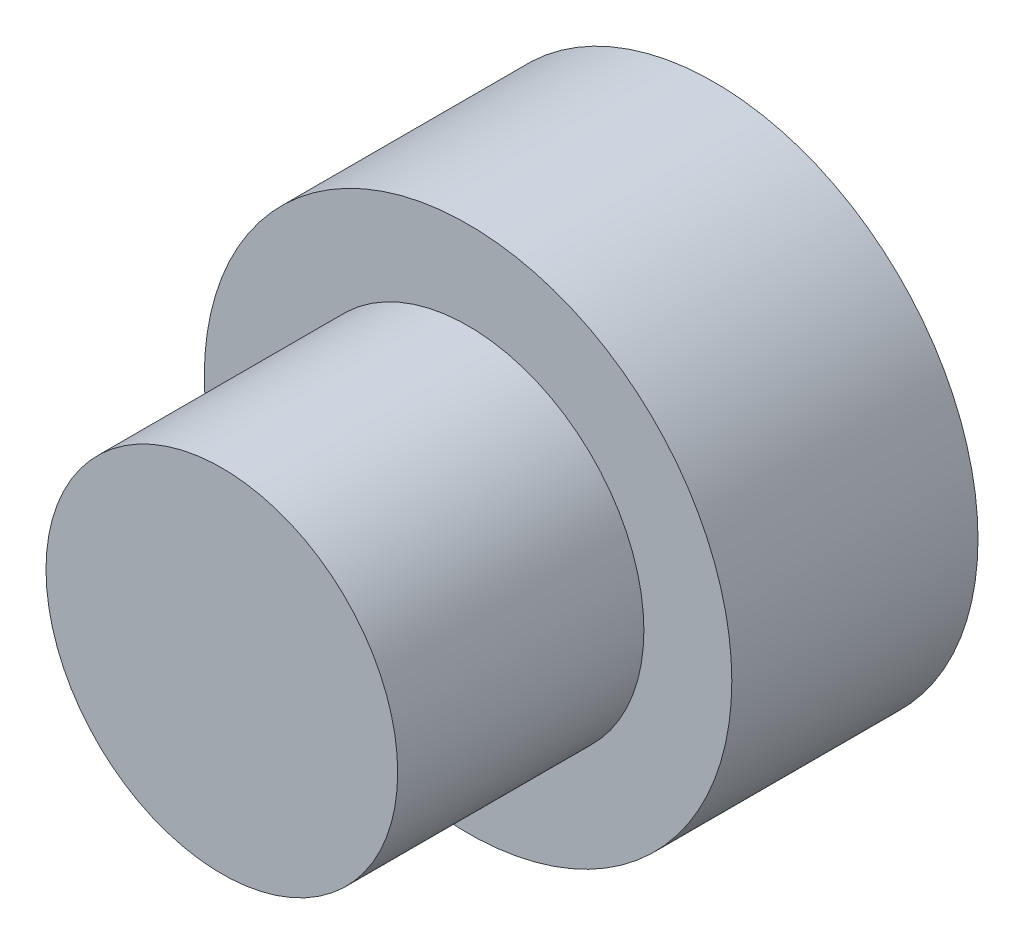
ISO-10303-21;
HEADER;
FILE_DESCRIPTION(('STEP AP214'),'2;1');
FILE_NAME('part.step','',(''),(''),'','','');
FILE_SCHEMA(('AUTOMOTIVE_DESIGN { 1 0 10303 214 1 1 1 1 }'));
ENDSEC;
DATA;
#1=APPLICATION_CONTEXT('core data for automotive mechanical design processes');
#2=APPLICATION_PROTOCOL_DEFINITION('international standard','automotive_design',2000,#1);
#3=PRODUCT_CONTEXT('',#1,'mechanical');
#4=PRODUCT('Part','Part','',(#3));
#5=PRODUCT_RELATED_PRODUCT_CATEGORY('part','',(#4));
#6=PRODUCT_DEFINITION_FORMATION('','',#4);
#7=PRODUCT_DEFINITION_CONTEXT('part definition',#1,'design');
#8=PRODUCT_DEFINITION('design','',#6,#7);
#9=PRODUCT_DEFINITION_SHAPE('','',#8);
#10=(LENGTH_UNIT() NAMED_UNIT(*) SI_UNIT(.MILLI.,.METRE.));
#11=(NAMED_UNIT(*) PLANE_ANGLE_UNIT() SI_UNIT($,.RADIAN.));
#12=(NAMED_UNIT(*) SI_UNIT($,.STERADIAN.) SOLID_ANGLE_UNIT());
#13=UNCERTAINTY_MEASURE_WITH_UNIT(LENGTH_MEASURE(1.E-05),#10,'distance_accuracy_value','');
#14=(GEOMETRIC_REPRESENTATION_CONTEXT(3) GLOBAL_UNCERTAINTY_ASSIGNED_CONTEXT((#13)) GLOBAL_UNIT_ASSIGNED_CONTEXT((#10,
#11,#12)) REPRESENTATION_CONTEXT('',''));
#15=CARTESIAN_POINT('',(0.,0.,0.));
#16=DIRECTION('',(0.,0.,1.));
#17=DIRECTION('',(1.,0.,0.));
#18=AXIS2_PLACEMENT_3D('',#15,#16,#17);
#19=CARTESIAN_POINT('',(0.,0.,7.));
#20=DIRECTION('',(0.,0.,-1.));
#21=DIRECTION('',(-1.,0.,0.));
#22=AXIS2_PLACEMENT_3D('',#19,#20,#21);
#23=CYLINDRICAL_SURFACE('',#22,7.5);
#24=CARTESIAN_POINT('',(0.,0.,7.));
#25=DIRECTION('',(0.,0.,1.));
#26=DIRECTION('',(1.,0.,0.));
#27=AXIS2_PLACEMENT_3D('',#24,#25,#26);
#28=CIRCLE('',#27,7.5);
#29=CARTESIAN_POINT('',(7.5,0.,7.));
#30=VERTEX_POINT('',#29);
#31=EDGE_CURVE('E43',#30,#30,#28,.T.);
#32=ORIENTED_EDGE('',*,*,#31,.F.);
#33=EDGE_LOOP('',(#32));
#34=FACE_BOUND('',#33,.T.);
#35=CARTESIAN_POINT('',(0.,0.,0.));
#36=DIRECTION('',(0.,0.,1.));
#37=DIRECTION('',(1.,0.,0.));
#38=AXIS2_PLACEMENT_3D('',#35,#36,#37);
#39=CIRCLE('',#38,7.5);
#40=CARTESIAN_POINT('',(7.5,0.,0.));
#41=VERTEX_POINT('',#40);
#42=EDGE_CURVE('E39',#41,#41,#39,.T.);
#43=ORIENTED_EDGE('',*,*,#42,.T.);
#44=EDGE_LOOP('',(#43));
#45=FACE_BOUND('',#44,.T.);
#46=ADVANCED_FACE('F36',(#34,#45),#23,.T.);
#47=CARTESIAN_POINT('',(0.,0.,7.));
#48=DIRECTION('',(0.,0.,1.));
#49=DIRECTION('',(1.,0.,0.));
#50=AXIS2_PLACEMENT_3D('',#47,#48,#49);
#51=PLANE('',#50);
#52=CARTESIAN_POINT('',(0.,0.,7.));
#53=DIRECTION('',(0.,0.,1.));
#54=DIRECTION('',(1.,0.,0.));
#55=AXIS2_PLACEMENT_3D('',#52,#53,#54);
#56=CIRCLE('',#55,5.);
#57=CARTESIAN_POINT('',(5.,0.,7.));
#58=VERTEX_POINT('',#57);
#59=EDGE_CURVE('E10',#58,#58,#56,.T.);
#60=ORIENTED_EDGE('',*,*,#59,.F.);
#61=EDGE_LOOP('',(#60));
#62=FACE_BOUND('',#61,.T.);
#63=ORIENTED_EDGE('',*,*,#31,.T.);
#64=EDGE_LOOP('',(#63));
#65=FACE_BOUND('',#64,.T.);
#66=ADVANCED_FACE('F72',(#62,#65),#51,.T.);
#67=CARTESIAN_POINT('',(0.,0.,0.));
#68=DIRECTION('',(0.,0.,1.));
#69=DIRECTION('',(1.,0.,0.));
#70=AXIS2_PLACEMENT_3D('',#67,#68,#69);
#71=PLANE('',#70);
#72=CARTESIAN_POINT('',(0.,0.,0.));
#73=DIRECTION('',(0.,0.,-1.));
#74=DIRECTION('',(-1.,0.,0.));
#75=AXIS2_PLACEMENT_3D('',#72,#73,#74);
#76=CIRCLE('',#75,2.5);
#77=CARTESIAN_POINT('',(-2.5,0.,0.));
#78=VERTEX_POINT('',#77);
#79=EDGE_CURVE('E53',#78,#78,#76,.T.);
#80=ORIENTED_EDGE('',*,*,#79,.F.);
#81=EDGE_LOOP('',(#80));
#82=FACE_BOUND('',#81,.T.);
#83=ORIENTED_EDGE('',*,*,#42,.F.);
#84=EDGE_LOOP('',(#83));
#85=FACE_BOUND('',#84,.T.);
#86=ADVANCED_FACE('F68',(#82,#85),#71,.F.);
#87=CARTESIAN_POINT('',(0.,0.,14.));
#88=DIRECTION('',(0.,0.,-1.));
#89=DIRECTION('',(-1.,0.,0.));
#90=AXIS2_PLACEMENT_3D('',#87,#88,#89);
#91=CYLINDRICAL_SURFACE('',#90,5.);
#92=CARTESIAN_POINT('',(0.,0.,14.));
#93=DIRECTION('',(0.,0.,1.));
#94=DIRECTION('',(1.,0.,0.));
#95=AXIS2_PLACEMENT_3D('',#92,#93,#94);
#96=CIRCLE('',#95,5.);
#97=CARTESIAN_POINT('',(5.,0.,14.));
#98=VERTEX_POINT('',#97);
#99=EDGE_CURVE('E49',#98,#98,#96,.T.);
#100=ORIENTED_EDGE('',*,*,#99,.F.);
#101=EDGE_LOOP('',(#100));
#102=FACE_BOUND('',#101,.T.);
#103=ORIENTED_EDGE('',*,*,#59,.T.);
#104=EDGE_LOOP('',(#103));
#105=FACE_BOUND('',#104,.T.);
#106=ADVANCED_FACE('F71',(#102,#105),#91,.T.);
#107=CARTESIAN_POINT('',(0.,0.,14.));
#108=DIRECTION('',(0.,0.,1.));
#109=DIRECTION('',(1.,0.,0.));
#110=AXIS2_PLACEMENT_3D('',#107,#108,#109);
#111=PLANE('',#110);
#112=ORIENTED_EDGE('',*,*,#99,.T.);
#113=EDGE_LOOP('',(#112));
#114=FACE_BOUND('',#113,.T.);
#115=ADVANCED_FACE('F64',(#114),#111,.T.);
#116=CARTESIAN_POINT('',(0.,0.,6.));
#117=DIRECTION('',(0.,0.,-1.));
#118=DIRECTION('',(-1.,0.,0.));
#119=AXIS2_PLACEMENT_3D('',#116,#117,#118);
#120=CYLINDRICAL_SURFACE('',#119,2.5);
#121=CARTESIAN_POINT('',(0.,0.,6.));
#122=DIRECTION('',(0.,0.,-1.));
#123=DIRECTION('',(-1.,0.,0.));
#124=AXIS2_PLACEMENT_3D('',#121,#122,#123);
#125=CIRCLE('',#124,2.5);
#126=CARTESIAN_POINT('',(-2.5,0.,6.));
#127=VERTEX_POINT('',#126);
#128=EDGE_CURVE('E52',#127,#127,#125,.T.);
#129=ORIENTED_EDGE('',*,*,#128,.F.);
#130=EDGE_LOOP('',(#129));
#131=FACE_BOUND('',#130,.T.);
#132=ORIENTED_EDGE('',*,*,#79,.T.);
#133=EDGE_LOOP('',(#132));
#134=FACE_BOUND('',#133,.T.);
#135=ADVANCED_FACE('F61',(#131,#134),#120,.F.);
#136=CARTESIAN_POINT('',(0.,0.,6.));
#137=DIRECTION('',(0.,0.,-1.));
#138=DIRECTION('',(-1.,0.,0.));
#139=AXIS2_PLACEMENT_3D('',#136,#137,#138);
#140=PLANE('',#139);
#141=ORIENTED_EDGE('',*,*,#128,.T.);
#142=EDGE_LOOP('',(#141));
#143=FACE_BOUND('',#142,.T.);
#144=ADVANCED_FACE('F59',(#143),#140,.T.);
#145=CLOSED_SHELL('',(#46,#66,#86,#106,#115,#135,#144));
#146=MANIFOLD_SOLID_BREP('B2',#145);
#147=ADVANCED_BREP_SHAPE_REPRESENTATION('',(#18,#146),#14);
#148=SHAPE_DEFINITION_REPRESENTATION(#9,#147);
ENDSEC;
END-ISO-10303-21;
